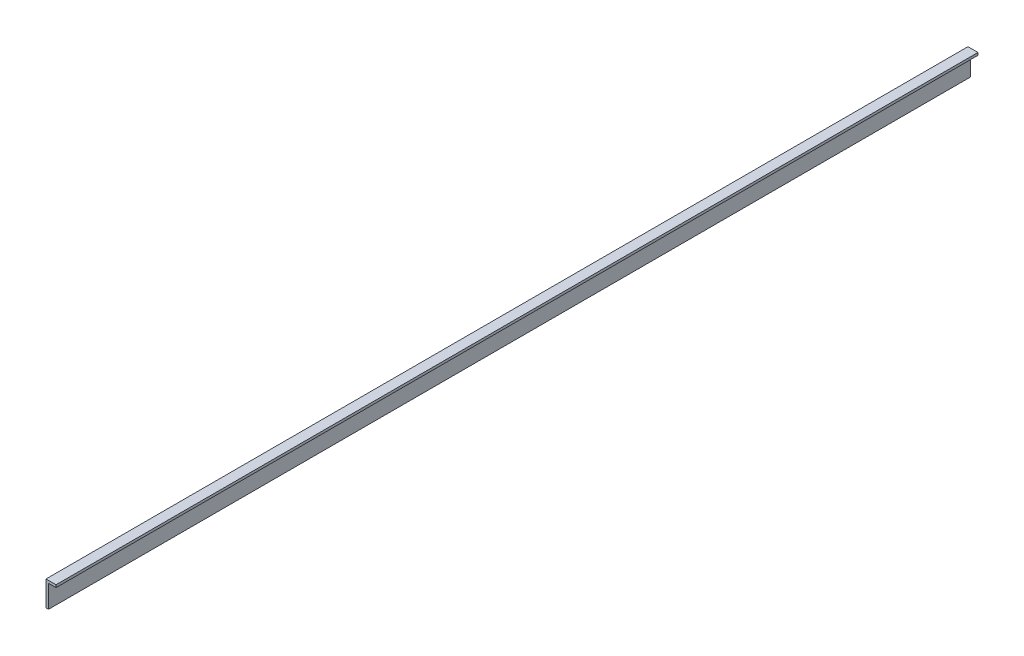
ISO-10303-21;
HEADER;
FILE_DESCRIPTION(('STEP AP214'),'2;1');
FILE_NAME('part.step','',(''),(''),'','','');
FILE_SCHEMA(('AUTOMOTIVE_DESIGN { 1 0 10303 214 1 1 1 1 }'));
ENDSEC;
DATA;
#1=APPLICATION_CONTEXT('core data for automotive mechanical design processes');
#2=APPLICATION_PROTOCOL_DEFINITION('international standard','automotive_design',2000,#1);
#3=PRODUCT_CONTEXT('',#1,'mechanical');
#4=PRODUCT('Part','Part','',(#3));
#5=PRODUCT_RELATED_PRODUCT_CATEGORY('part','',(#4));
#6=PRODUCT_DEFINITION_FORMATION('','',#4);
#7=PRODUCT_DEFINITION_CONTEXT('part definition',#1,'design');
#8=PRODUCT_DEFINITION('design','',#6,#7);
#9=PRODUCT_DEFINITION_SHAPE('','',#8);
#10=(LENGTH_UNIT() NAMED_UNIT(*) SI_UNIT(.MILLI.,.METRE.));
#11=(NAMED_UNIT(*) PLANE_ANGLE_UNIT() SI_UNIT($,.RADIAN.));
#12=(NAMED_UNIT(*) SI_UNIT($,.STERADIAN.) SOLID_ANGLE_UNIT());
#13=UNCERTAINTY_MEASURE_WITH_UNIT(LENGTH_MEASURE(1.E-05),#10,'distance_accuracy_value','');
#14=(GEOMETRIC_REPRESENTATION_CONTEXT(3) GLOBAL_UNCERTAINTY_ASSIGNED_CONTEXT((#13)) GLOBAL_UNIT_ASSIGNED_CONTEXT((#10,
#11,#12)) REPRESENTATION_CONTEXT('',''));
#15=CARTESIAN_POINT('',(0.,0.,0.));
#16=DIRECTION('',(0.,0.,1.));
#17=DIRECTION('',(1.,0.,0.));
#18=AXIS2_PLACEMENT_3D('',#15,#16,#17);
#19=CARTESIAN_POINT('',(541.5,422.5,-755.5));
#20=DIRECTION('',(1.,0.,0.));
#21=DIRECTION('',(0.,0.,-1.));
#22=AXIS2_PLACEMENT_3D('',#19,#20,#21);
#23=PLANE('',#22);
#24=DIRECTION('',(0.,1.,0.));
#25=VECTOR('',#24,1.);
#26=CARTESIAN_POINT('',(541.5,422.5,-20.));
#27=LINE('',#26,#25);
#28=CARTESIAN_POINT('',(541.5,404.5,-20.));
#29=VERTEX_POINT('',#28);
#30=CARTESIAN_POINT('',(541.5,422.5,-20.));
#31=VERTEX_POINT('',#30);
#32=EDGE_CURVE('E124',#29,#31,#27,.T.);
#33=ORIENTED_EDGE('',*,*,#32,.F.);
#34=DIRECTION('',(0.,0.,1.));
#35=VECTOR('',#34,1.);
#36=CARTESIAN_POINT('',(541.5,404.5,-755.5));
#37=LINE('',#36,#35);
#38=CARTESIAN_POINT('',(541.5,404.5,-755.5));
#39=VERTEX_POINT('',#38);
#40=EDGE_CURVE('E11',#39,#29,#37,.T.);
#41=ORIENTED_EDGE('',*,*,#40,.F.);
#42=DIRECTION('',(0.,1.,0.));
#43=VECTOR('',#42,1.);
#44=CARTESIAN_POINT('',(541.5,422.5,-755.5));
#45=LINE('',#44,#43);
#46=CARTESIAN_POINT('',(541.5,422.5,-755.5));
#47=VERTEX_POINT('',#46);
#48=EDGE_CURVE('E138',#39,#47,#45,.T.);
#49=ORIENTED_EDGE('',*,*,#48,.T.);
#50=DIRECTION('',(0.,0.,1.));
#51=VECTOR('',#50,1.);
#52=CARTESIAN_POINT('',(541.5,422.5,-755.5));
#53=LINE('',#52,#51);
#54=EDGE_CURVE('E42',#47,#31,#53,.T.);
#55=ORIENTED_EDGE('',*,*,#54,.T.);
#56=EDGE_LOOP('',(#33,#41,#49,#55));
#57=FACE_BOUND('',#56,.T.);
#58=ADVANCED_FACE('F39',(#57),#23,.T.);
#59=CARTESIAN_POINT('',(541.5,404.5,-755.5));
#60=DIRECTION('',(0.,-1.,0.));
#61=DIRECTION('',(0.,0.,-1.));
#62=AXIS2_PLACEMENT_3D('',#59,#60,#61);
#63=PLANE('',#62);
#64=DIRECTION('',(1.,0.,0.));
#65=VECTOR('',#64,1.);
#66=CARTESIAN_POINT('',(541.5,404.5,-20.));
#67=LINE('',#66,#65);
#68=CARTESIAN_POINT('',(539.5,404.5,-20.));
#69=VERTEX_POINT('',#68);
#70=EDGE_CURVE('E136',#69,#29,#67,.T.);
#71=ORIENTED_EDGE('',*,*,#70,.F.);
#72=DIRECTION('',(0.,0.,1.));
#73=VECTOR('',#72,1.);
#74=CARTESIAN_POINT('',(539.5,404.5,-755.5));
#75=LINE('',#74,#73);
#76=CARTESIAN_POINT('',(539.5,404.5,-755.5));
#77=VERTEX_POINT('',#76);
#78=EDGE_CURVE('E48',#77,#69,#75,.T.);
#79=ORIENTED_EDGE('',*,*,#78,.F.);
#80=DIRECTION('',(1.,0.,0.));
#81=VECTOR('',#80,1.);
#82=CARTESIAN_POINT('',(541.5,404.5,-755.5));
#83=LINE('',#82,#81);
#84=EDGE_CURVE('E114',#77,#39,#83,.T.);
#85=ORIENTED_EDGE('',*,*,#84,.T.);
#86=ORIENTED_EDGE('',*,*,#40,.T.);
#87=EDGE_LOOP('',(#71,#79,#85,#86));
#88=FACE_BOUND('',#87,.T.);
#89=ADVANCED_FACE('F146',(#88),#63,.T.);
#90=CARTESIAN_POINT('',(539.5,404.5,-755.5));
#91=DIRECTION('',(-1.,0.,0.));
#92=DIRECTION('',(0.,0.,1.));
#93=AXIS2_PLACEMENT_3D('',#90,#91,#92);
#94=PLANE('',#93);
#95=DIRECTION('',(0.,-1.,0.));
#96=VECTOR('',#95,1.);
#97=CARTESIAN_POINT('',(539.5,404.5,-20.));
#98=LINE('',#97,#96);
#99=CARTESIAN_POINT('',(539.5,424.5,-20.));
#100=VERTEX_POINT('',#99);
#101=EDGE_CURVE('E101',#100,#69,#98,.T.);
#102=ORIENTED_EDGE('',*,*,#101,.F.);
#103=DIRECTION('',(0.,0.,1.));
#104=VECTOR('',#103,1.);
#105=CARTESIAN_POINT('',(539.5,424.5,-755.5));
#106=LINE('',#105,#104);
#107=CARTESIAN_POINT('',(539.5,424.5,-755.5));
#108=VERTEX_POINT('',#107);
#109=EDGE_CURVE('E96',#108,#100,#106,.T.);
#110=ORIENTED_EDGE('',*,*,#109,.F.);
#111=DIRECTION('',(0.,-1.,0.));
#112=VECTOR('',#111,1.);
#113=CARTESIAN_POINT('',(539.5,404.5,-755.5));
#114=LINE('',#113,#112);
#115=EDGE_CURVE('E99',#108,#77,#114,.T.);
#116=ORIENTED_EDGE('',*,*,#115,.T.);
#117=ORIENTED_EDGE('',*,*,#78,.T.);
#118=EDGE_LOOP('',(#102,#110,#116,#117));
#119=FACE_BOUND('',#118,.T.);
#120=ADVANCED_FACE('F98',(#119),#94,.T.);
#121=CARTESIAN_POINT('',(539.5,424.5,-755.5));
#122=DIRECTION('',(0.,1.,0.));
#123=DIRECTION('',(0.,0.,1.));
#124=AXIS2_PLACEMENT_3D('',#121,#122,#123);
#125=PLANE('',#124);
#126=DIRECTION('',(-1.,0.,0.));
#127=VECTOR('',#126,1.);
#128=CARTESIAN_POINT('',(539.5,424.5,-20.));
#129=LINE('',#128,#127);
#130=CARTESIAN_POINT('',(547.5,424.5,-20.));
#131=VERTEX_POINT('',#130);
#132=EDGE_CURVE('E133',#131,#100,#129,.T.);
#133=ORIENTED_EDGE('',*,*,#132,.F.);
#134=DIRECTION('',(0.,0.,1.));
#135=VECTOR('',#134,1.);
#136=CARTESIAN_POINT('',(547.5,424.5,-755.5));
#137=LINE('',#136,#135);
#138=CARTESIAN_POINT('',(547.5,424.5,-755.5));
#139=VERTEX_POINT('',#138);
#140=EDGE_CURVE('E106',#139,#131,#137,.T.);
#141=ORIENTED_EDGE('',*,*,#140,.F.);
#142=DIRECTION('',(-1.,0.,0.));
#143=VECTOR('',#142,1.);
#144=CARTESIAN_POINT('',(539.5,424.5,-755.5));
#145=LINE('',#144,#143);
#146=EDGE_CURVE('E112',#139,#108,#145,.T.);
#147=ORIENTED_EDGE('',*,*,#146,.T.);
#148=ORIENTED_EDGE('',*,*,#109,.T.);
#149=EDGE_LOOP('',(#133,#141,#147,#148));
#150=FACE_BOUND('',#149,.T.);
#151=ADVANCED_FACE('F116',(#150),#125,.T.);
#152=CARTESIAN_POINT('',(547.5,424.5,-755.5));
#153=DIRECTION('',(1.,0.,0.));
#154=DIRECTION('',(0.,0.,-1.));
#155=AXIS2_PLACEMENT_3D('',#152,#153,#154);
#156=PLANE('',#155);
#157=DIRECTION('',(0.,1.,0.));
#158=VECTOR('',#157,1.);
#159=CARTESIAN_POINT('',(547.5,424.5,-20.));
#160=LINE('',#159,#158);
#161=CARTESIAN_POINT('',(547.5,422.5,-20.));
#162=VERTEX_POINT('',#161);
#163=EDGE_CURVE('E130',#162,#131,#160,.T.);
#164=ORIENTED_EDGE('',*,*,#163,.F.);
#165=DIRECTION('',(0.,0.,1.));
#166=VECTOR('',#165,1.);
#167=CARTESIAN_POINT('',(547.5,422.5,-755.5));
#168=LINE('',#167,#166);
#169=CARTESIAN_POINT('',(547.5,422.5,-755.5));
#170=VERTEX_POINT('',#169);
#171=EDGE_CURVE('E141',#170,#162,#168,.T.);
#172=ORIENTED_EDGE('',*,*,#171,.F.);
#173=DIRECTION('',(0.,1.,0.));
#174=VECTOR('',#173,1.);
#175=CARTESIAN_POINT('',(547.5,424.5,-755.5));
#176=LINE('',#175,#174);
#177=EDGE_CURVE('E117',#170,#139,#176,.T.);
#178=ORIENTED_EDGE('',*,*,#177,.T.);
#179=ORIENTED_EDGE('',*,*,#140,.T.);
#180=EDGE_LOOP('',(#164,#172,#178,#179));
#181=FACE_BOUND('',#180,.T.);
#182=ADVANCED_FACE('F159',(#181),#156,.T.);
#183=CARTESIAN_POINT('',(547.5,422.5,-755.5));
#184=DIRECTION('',(0.,-1.,0.));
#185=DIRECTION('',(0.,0.,-1.));
#186=AXIS2_PLACEMENT_3D('',#183,#184,#185);
#187=PLANE('',#186);
#188=DIRECTION('',(1.,0.,0.));
#189=VECTOR('',#188,1.);
#190=CARTESIAN_POINT('',(547.5,422.5,-20.));
#191=LINE('',#190,#189);
#192=EDGE_CURVE('E127',#31,#162,#191,.T.);
#193=ORIENTED_EDGE('',*,*,#192,.F.);
#194=ORIENTED_EDGE('',*,*,#54,.F.);
#195=DIRECTION('',(1.,0.,0.));
#196=VECTOR('',#195,1.);
#197=CARTESIAN_POINT('',(547.5,422.5,-755.5));
#198=LINE('',#197,#196);
#199=EDGE_CURVE('E119',#47,#170,#198,.T.);
#200=ORIENTED_EDGE('',*,*,#199,.T.);
#201=ORIENTED_EDGE('',*,*,#171,.T.);
#202=EDGE_LOOP('',(#193,#194,#200,#201));
#203=FACE_BOUND('',#202,.T.);
#204=ADVANCED_FACE('F143',(#203),#187,.T.);
#205=CARTESIAN_POINT('',(0.,0.,-755.5));
#206=DIRECTION('',(0.,0.,-1.));
#207=DIRECTION('',(-1.,0.,0.));
#208=AXIS2_PLACEMENT_3D('',#205,#206,#207);
#209=PLANE('',#208);
#210=ORIENTED_EDGE('',*,*,#48,.F.);
#211=ORIENTED_EDGE('',*,*,#84,.F.);
#212=ORIENTED_EDGE('',*,*,#115,.F.);
#213=ORIENTED_EDGE('',*,*,#146,.F.);
#214=ORIENTED_EDGE('',*,*,#177,.F.);
#215=ORIENTED_EDGE('',*,*,#199,.F.);
#216=EDGE_LOOP('',(#210,#211,#212,#213,#214,#215));
#217=FACE_BOUND('',#216,.T.);
#218=ADVANCED_FACE('F110',(#217),#209,.T.);
#219=CARTESIAN_POINT('',(0.,0.,-20.));
#220=DIRECTION('',(0.,0.,-1.));
#221=DIRECTION('',(-1.,0.,0.));
#222=AXIS2_PLACEMENT_3D('',#219,#220,#221);
#223=PLANE('',#222);
#224=ORIENTED_EDGE('',*,*,#32,.T.);
#225=ORIENTED_EDGE('',*,*,#192,.T.);
#226=ORIENTED_EDGE('',*,*,#163,.T.);
#227=ORIENTED_EDGE('',*,*,#132,.T.);
#228=ORIENTED_EDGE('',*,*,#101,.T.);
#229=ORIENTED_EDGE('',*,*,#70,.T.);
#230=EDGE_LOOP('',(#224,#225,#226,#227,#228,#229));
#231=FACE_BOUND('',#230,.T.);
#232=ADVANCED_FACE('F145',(#231),#223,.F.);
#233=CLOSED_SHELL('',(#58,#89,#120,#151,#182,#204,#218,#232));
#234=MANIFOLD_SOLID_BREP('B2',#233);
#235=ADVANCED_BREP_SHAPE_REPRESENTATION('',(#18,#234),#14);
#236=SHAPE_DEFINITION_REPRESENTATION(#9,#235);
ENDSEC;
END-ISO-10303-21;
